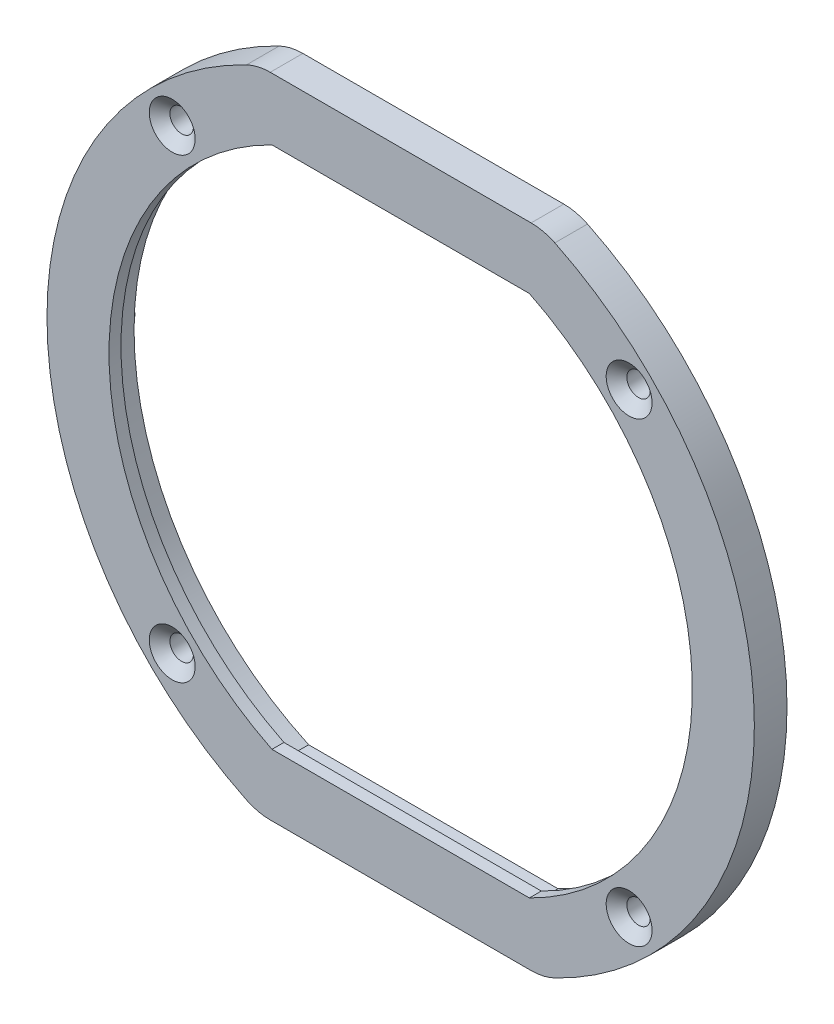
ISO-10303-21;
HEADER;
FILE_DESCRIPTION(('STEP AP214'),'2;1');
FILE_NAME('part.step','',(''),(''),'','','');
FILE_SCHEMA(('AUTOMOTIVE_DESIGN { 1 0 10303 214 1 1 1 1 }'));
ENDSEC;
DATA;
#1=APPLICATION_CONTEXT('core data for automotive mechanical design processes');
#2=APPLICATION_PROTOCOL_DEFINITION('international standard','automotive_design',2000,#1);
#3=PRODUCT_CONTEXT('',#1,'mechanical');
#4=PRODUCT('Part','Part','',(#3));
#5=PRODUCT_RELATED_PRODUCT_CATEGORY('part','',(#4));
#6=PRODUCT_DEFINITION_FORMATION('','',#4);
#7=PRODUCT_DEFINITION_CONTEXT('part definition',#1,'design');
#8=PRODUCT_DEFINITION('design','',#6,#7);
#9=PRODUCT_DEFINITION_SHAPE('','',#8);
#10=(LENGTH_UNIT() NAMED_UNIT(*) SI_UNIT(.MILLI.,.METRE.));
#11=(NAMED_UNIT(*) PLANE_ANGLE_UNIT() SI_UNIT($,.RADIAN.));
#12=(NAMED_UNIT(*) SI_UNIT($,.STERADIAN.) SOLID_ANGLE_UNIT());
#13=UNCERTAINTY_MEASURE_WITH_UNIT(LENGTH_MEASURE(1.E-05),#10,'distance_accuracy_value','');
#14=(GEOMETRIC_REPRESENTATION_CONTEXT(3) GLOBAL_UNCERTAINTY_ASSIGNED_CONTEXT((#13)) GLOBAL_UNIT_ASSIGNED_CONTEXT((#10,
#11,#12)) REPRESENTATION_CONTEXT('',''));
#15=CARTESIAN_POINT('',(0.,0.,0.));
#16=DIRECTION('',(0.,0.,1.));
#17=DIRECTION('',(1.,0.,0.));
#18=AXIS2_PLACEMENT_3D('',#15,#16,#17);
#19=CARTESIAN_POINT('',(0.,0.,6.));
#20=DIRECTION('',(0.,0.,-1.));
#21=DIRECTION('',(-1.,0.,0.));
#22=AXIS2_PLACEMENT_3D('',#19,#20,#21);
#23=CYLINDRICAL_SURFACE('',#22,53.6);
#24=DIRECTION('',(0.,0.,-1.));
#25=VECTOR('',#24,1.);
#26=CARTESIAN_POINT('',(23.6505813882027,48.1,6.));
#27=LINE('',#26,#25);
#28=CARTESIAN_POINT('',(23.6505813882027,48.1,6.));
#29=VERTEX_POINT('',#28);
#30=CARTESIAN_POINT('',(23.6505813882027,48.1,3.8));
#31=VERTEX_POINT('',#30);
#32=EDGE_CURVE('E294',#29,#31,#27,.T.);
#33=ORIENTED_EDGE('',*,*,#32,.T.);
#34=CARTESIAN_POINT('',(0.,0.,3.8));
#35=DIRECTION('',(0.,0.,-1.));
#36=DIRECTION('',(-1.,0.,0.));
#37=AXIS2_PLACEMENT_3D('',#34,#35,#36);
#38=CIRCLE('',#37,53.6);
#39=CARTESIAN_POINT('',(23.6505813882027,-48.1,3.8));
#40=VERTEX_POINT('',#39);
#41=EDGE_CURVE('E209',#31,#40,#38,.T.);
#42=ORIENTED_EDGE('',*,*,#41,.T.);
#43=DIRECTION('',(0.,0.,-1.));
#44=VECTOR('',#43,1.);
#45=CARTESIAN_POINT('',(23.6505813882027,-48.1,6.));
#46=LINE('',#45,#44);
#47=CARTESIAN_POINT('',(23.6505813882027,-48.1,6.));
#48=VERTEX_POINT('',#47);
#49=EDGE_CURVE('E282',#48,#40,#46,.T.);
#50=ORIENTED_EDGE('',*,*,#49,.F.);
#51=CARTESIAN_POINT('',(0.,0.,6.));
#52=DIRECTION('',(0.,0.,1.));
#53=DIRECTION('',(1.,0.,0.));
#54=AXIS2_PLACEMENT_3D('',#51,#52,#53);
#55=CIRCLE('',#54,53.6);
#56=EDGE_CURVE('E269',#48,#29,#55,.T.);
#57=ORIENTED_EDGE('',*,*,#56,.T.);
#58=EDGE_LOOP('',(#33,#42,#50,#57));
#59=FACE_BOUND('',#58,.T.);
#60=ADVANCED_FACE('F40',(#59),#23,.F.);
#61=CARTESIAN_POINT('',(-23.6505813882027,48.1,6.));
#62=DIRECTION('',(0.,-1.,0.));
#63=DIRECTION('',(0.,0.,-1.));
#64=AXIS2_PLACEMENT_3D('',#61,#62,#63);
#65=PLANE('',#64);
#66=DIRECTION('',(0.,0.,-1.));
#67=VECTOR('',#66,1.);
#68=CARTESIAN_POINT('',(-23.6505813882027,48.1,6.));
#69=LINE('',#68,#67);
#70=CARTESIAN_POINT('',(-23.6505813882027,48.1,6.));
#71=VERTEX_POINT('',#70);
#72=CARTESIAN_POINT('',(-23.6505813882027,48.1,3.8));
#73=VERTEX_POINT('',#72);
#74=EDGE_CURVE('E290',#71,#73,#69,.T.);
#75=ORIENTED_EDGE('',*,*,#74,.T.);
#76=DIRECTION('',(1.,0.,0.));
#77=VECTOR('',#76,1.);
#78=CARTESIAN_POINT('',(-23.6505813882027,48.1,3.8));
#79=LINE('',#78,#77);
#80=EDGE_CURVE('E205',#73,#31,#79,.T.);
#81=ORIENTED_EDGE('',*,*,#80,.T.);
#82=ORIENTED_EDGE('',*,*,#32,.F.);
#83=DIRECTION('',(-1.,0.,0.));
#84=VECTOR('',#83,1.);
#85=CARTESIAN_POINT('',(-23.6505813882027,48.1,6.));
#86=LINE('',#85,#84);
#87=EDGE_CURVE('E272',#29,#71,#86,.T.);
#88=ORIENTED_EDGE('',*,*,#87,.T.);
#89=EDGE_LOOP('',(#75,#81,#82,#88));
#90=FACE_BOUND('',#89,.T.);
#91=ADVANCED_FACE('F434',(#90),#65,.T.);
#92=CARTESIAN_POINT('',(0.,0.,6.));
#93=DIRECTION('',(0.,0.,-1.));
#94=DIRECTION('',(-1.,0.,0.));
#95=AXIS2_PLACEMENT_3D('',#92,#93,#94);
#96=CYLINDRICAL_SURFACE('',#95,53.6);
#97=DIRECTION('',(0.,0.,-1.));
#98=VECTOR('',#97,1.);
#99=CARTESIAN_POINT('',(-23.6505813882027,-48.1,6.));
#100=LINE('',#99,#98);
#101=CARTESIAN_POINT('',(-23.6505813882027,-48.1,6.));
#102=VERTEX_POINT('',#101);
#103=CARTESIAN_POINT('',(-23.6505813882027,-48.1,3.8));
#104=VERTEX_POINT('',#103);
#105=EDGE_CURVE('E286',#102,#104,#100,.T.);
#106=ORIENTED_EDGE('',*,*,#105,.T.);
#107=CARTESIAN_POINT('',(0.,0.,3.8));
#108=DIRECTION('',(0.,0.,-1.));
#109=DIRECTION('',(-1.,0.,0.));
#110=AXIS2_PLACEMENT_3D('',#107,#108,#109);
#111=CIRCLE('',#110,53.6);
#112=EDGE_CURVE('E64',#104,#73,#111,.T.);
#113=ORIENTED_EDGE('',*,*,#112,.T.);
#114=ORIENTED_EDGE('',*,*,#74,.F.);
#115=CARTESIAN_POINT('',(0.,0.,6.));
#116=DIRECTION('',(0.,0.,1.));
#117=DIRECTION('',(1.,0.,0.));
#118=AXIS2_PLACEMENT_3D('',#115,#116,#117);
#119=CIRCLE('',#118,53.6);
#120=EDGE_CURVE('E275',#71,#102,#119,.T.);
#121=ORIENTED_EDGE('',*,*,#120,.T.);
#122=EDGE_LOOP('',(#106,#113,#114,#121));
#123=FACE_BOUND('',#122,.T.);
#124=ADVANCED_FACE('F441',(#123),#96,.F.);
#125=CARTESIAN_POINT('',(-23.6505813882027,-48.1,6.));
#126=DIRECTION('',(0.,1.,0.));
#127=DIRECTION('',(0.,0.,1.));
#128=AXIS2_PLACEMENT_3D('',#125,#126,#127);
#129=PLANE('',#128);
#130=ORIENTED_EDGE('',*,*,#49,.T.);
#131=DIRECTION('',(-1.,0.,0.));
#132=VECTOR('',#131,1.);
#133=CARTESIAN_POINT('',(-23.6505813882027,-48.1,3.8));
#134=LINE('',#133,#132);
#135=EDGE_CURVE('E11',#40,#104,#134,.T.);
#136=ORIENTED_EDGE('',*,*,#135,.T.);
#137=ORIENTED_EDGE('',*,*,#105,.F.);
#138=DIRECTION('',(1.,0.,0.));
#139=VECTOR('',#138,1.);
#140=CARTESIAN_POINT('',(-23.6505813882027,-48.1,6.));
#141=LINE('',#140,#139);
#142=EDGE_CURVE('E279',#102,#48,#141,.T.);
#143=ORIENTED_EDGE('',*,*,#142,.T.);
#144=EDGE_LOOP('',(#130,#136,#137,#143));
#145=FACE_BOUND('',#144,.T.);
#146=ADVANCED_FACE('F448',(#145),#129,.T.);
#147=CARTESIAN_POINT('',(0.,0.,6.));
#148=DIRECTION('',(0.,0.,1.));
#149=DIRECTION('',(1.,0.,0.));
#150=AXIS2_PLACEMENT_3D('',#147,#148,#149);
#151=PLANE('',#150);
#152=CARTESIAN_POINT('',(41.985,41.985,6.));
#153=DIRECTION('',(0.,0.,1.));
#154=DIRECTION('',(1.,0.,0.));
#155=AXIS2_PLACEMENT_3D('',#152,#153,#154);
#156=CIRCLE('',#155,4.2164);
#157=CARTESIAN_POINT('',(46.2014,41.985,6.));
#158=VERTEX_POINT('',#157);
#159=EDGE_CURVE('E221',#158,#158,#156,.T.);
#160=ORIENTED_EDGE('',*,*,#159,.F.);
#161=EDGE_LOOP('',(#160));
#162=FACE_BOUND('',#161,.T.);
#163=CARTESIAN_POINT('',(-41.985,-41.985,6.));
#164=DIRECTION('',(0.,0.,1.));
#165=DIRECTION('',(1.,0.,0.));
#166=AXIS2_PLACEMENT_3D('',#163,#164,#165);
#167=CIRCLE('',#166,4.2164);
#168=CARTESIAN_POINT('',(-37.7686,-41.985,6.));
#169=VERTEX_POINT('',#168);
#170=EDGE_CURVE('E233',#169,#169,#167,.T.);
#171=ORIENTED_EDGE('',*,*,#170,.F.);
#172=EDGE_LOOP('',(#171));
#173=FACE_BOUND('',#172,.T.);
#174=CARTESIAN_POINT('',(-41.985,41.985,6.));
#175=DIRECTION('',(0.,0.,1.));
#176=DIRECTION('',(1.,0.,0.));
#177=AXIS2_PLACEMENT_3D('',#174,#175,#176);
#178=CIRCLE('',#177,4.2164);
#179=CARTESIAN_POINT('',(-37.7686,41.985,6.));
#180=VERTEX_POINT('',#179);
#181=EDGE_CURVE('E245',#180,#180,#178,.T.);
#182=ORIENTED_EDGE('',*,*,#181,.F.);
#183=EDGE_LOOP('',(#182));
#184=FACE_BOUND('',#183,.T.);
#185=CARTESIAN_POINT('',(41.985,-41.985,6.));
#186=DIRECTION('',(0.,0.,1.));
#187=DIRECTION('',(1.,0.,0.));
#188=AXIS2_PLACEMENT_3D('',#185,#186,#187);
#189=CIRCLE('',#188,4.2164);
#190=CARTESIAN_POINT('',(46.2014,-41.985,6.));
#191=VERTEX_POINT('',#190);
#192=EDGE_CURVE('E257',#191,#191,#189,.T.);
#193=ORIENTED_EDGE('',*,*,#192,.F.);
#194=EDGE_LOOP('',(#193));
#195=FACE_BOUND('',#194,.T.);
#196=DIRECTION('',(1.,0.,0.));
#197=VECTOR('',#196,1.);
#198=CARTESIAN_POINT('',(-26.167728216259,-59.5,6.));
#199=LINE('',#198,#197);
#200=CARTESIAN_POINT('',(-23.9739441894737,-59.5,6.));
#201=VERTEX_POINT('',#200);
#202=CARTESIAN_POINT('',(23.9739441894737,-59.5,6.));
#203=VERTEX_POINT('',#202);
#204=EDGE_CURVE('E312',#201,#203,#199,.T.);
#205=ORIENTED_EDGE('',*,*,#204,.T.);
#206=CARTESIAN_POINT('',(23.9739441894737,-49.5,6.));
#207=DIRECTION('',(0.,0.,1.));
#208=DIRECTION('',(1.,0.,0.));
#209=AXIS2_PLACEMENT_3D('',#206,#207,#208);
#210=CIRCLE('',#209,10.);
#211=CARTESIAN_POINT('',(28.3328431330144,-58.5,6.));
#212=VERTEX_POINT('',#211);
#213=EDGE_CURVE('E373',#203,#212,#210,.T.);
#214=ORIENTED_EDGE('',*,*,#213,.T.);
#215=CARTESIAN_POINT('',(0.,0.,6.));
#216=DIRECTION('',(0.,0.,1.));
#217=DIRECTION('',(1.,0.,0.));
#218=AXIS2_PLACEMENT_3D('',#215,#216,#217);
#219=CIRCLE('',#218,65.);
#220=CARTESIAN_POINT('',(28.3328431330144,58.5,6.));
#221=VERTEX_POINT('',#220);
#222=EDGE_CURVE('E299',#212,#221,#219,.T.);
#223=ORIENTED_EDGE('',*,*,#222,.T.);
#224=CARTESIAN_POINT('',(23.9739441894737,49.5,6.));
#225=DIRECTION('',(0.,0.,1.));
#226=DIRECTION('',(1.,0.,0.));
#227=AXIS2_PLACEMENT_3D('',#224,#225,#226);
#228=CIRCLE('',#227,10.);
#229=CARTESIAN_POINT('',(23.9739441894737,59.5,6.));
#230=VERTEX_POINT('',#229);
#231=EDGE_CURVE('E367',#221,#230,#228,.T.);
#232=ORIENTED_EDGE('',*,*,#231,.T.);
#233=DIRECTION('',(-1.,0.,0.));
#234=VECTOR('',#233,1.);
#235=CARTESIAN_POINT('',(-26.167728216259,59.5,6.));
#236=LINE('',#235,#234);
#237=CARTESIAN_POINT('',(-23.9739441894737,59.5,6.));
#238=VERTEX_POINT('',#237);
#239=EDGE_CURVE('E303',#230,#238,#236,.T.);
#240=ORIENTED_EDGE('',*,*,#239,.T.);
#241=CARTESIAN_POINT('',(-23.9739441894737,49.5,6.));
#242=DIRECTION('',(0.,0.,1.));
#243=DIRECTION('',(1.,0.,0.));
#244=AXIS2_PLACEMENT_3D('',#241,#242,#243);
#245=CIRCLE('',#244,10.);
#246=CARTESIAN_POINT('',(-28.3328431330144,58.5,6.));
#247=VERTEX_POINT('',#246);
#248=EDGE_CURVE('E364',#238,#247,#245,.T.);
#249=ORIENTED_EDGE('',*,*,#248,.T.);
#250=CARTESIAN_POINT('',(0.,0.,6.));
#251=DIRECTION('',(0.,0.,1.));
#252=DIRECTION('',(1.,0.,0.));
#253=AXIS2_PLACEMENT_3D('',#250,#251,#252);
#254=CIRCLE('',#253,65.);
#255=CARTESIAN_POINT('',(-28.3328431330144,-58.5,6.));
#256=VERTEX_POINT('',#255);
#257=EDGE_CURVE('E308',#247,#256,#254,.T.);
#258=ORIENTED_EDGE('',*,*,#257,.T.);
#259=CARTESIAN_POINT('',(-23.9739441894737,-49.5,6.));
#260=DIRECTION('',(0.,0.,1.));
#261=DIRECTION('',(1.,0.,0.));
#262=AXIS2_PLACEMENT_3D('',#259,#260,#261);
#263=CIRCLE('',#262,10.);
#264=EDGE_CURVE('E370',#256,#201,#263,.T.);
#265=ORIENTED_EDGE('',*,*,#264,.T.);
#266=EDGE_LOOP('',(#205,#214,#223,#232,#240,#249,#258,#265));
#267=FACE_BOUND('',#266,.T.);
#268=ORIENTED_EDGE('',*,*,#87,.F.);
#269=ORIENTED_EDGE('',*,*,#56,.F.);
#270=ORIENTED_EDGE('',*,*,#142,.F.);
#271=ORIENTED_EDGE('',*,*,#120,.F.);
#272=EDGE_LOOP('',(#268,#269,#270,#271));
#273=FACE_BOUND('',#272,.T.);
#274=ADVANCED_FACE('F408',(#162,#173,#184,#195,#267,#273),#151,.T.);
#275=CARTESIAN_POINT('',(0.,0.,0.));
#276=DIRECTION('',(0.,0.,1.));
#277=DIRECTION('',(1.,0.,0.));
#278=AXIS2_PLACEMENT_3D('',#275,#276,#277);
#279=PLANE('',#278);
#280=DIRECTION('',(1.,0.,0.));
#281=VECTOR('',#280,1.);
#282=CARTESIAN_POINT('',(-22.9128784747792,50.,0.));
#283=LINE('',#282,#281);
#284=CARTESIAN_POINT('',(-22.9128784747792,50.,0.));
#285=VERTEX_POINT('',#284);
#286=CARTESIAN_POINT('',(22.9128784747792,50.,0.));
#287=VERTEX_POINT('',#286);
#288=EDGE_CURVE('E189',#285,#287,#283,.T.);
#289=ORIENTED_EDGE('',*,*,#288,.F.);
#290=CARTESIAN_POINT('',(0.,0.,0.));
#291=DIRECTION('',(0.,0.,-1.));
#292=DIRECTION('',(-1.,0.,0.));
#293=AXIS2_PLACEMENT_3D('',#290,#291,#292);
#294=CIRCLE('',#293,55.);
#295=CARTESIAN_POINT('',(-22.9128784747792,-50.,0.));
#296=VERTEX_POINT('',#295);
#297=EDGE_CURVE('E56',#296,#285,#294,.T.);
#298=ORIENTED_EDGE('',*,*,#297,.F.);
#299=DIRECTION('',(-1.,0.,0.));
#300=VECTOR('',#299,1.);
#301=CARTESIAN_POINT('',(22.9128784747792,-50.,0.));
#302=LINE('',#301,#300);
#303=CARTESIAN_POINT('',(22.9128784747792,-50.,0.));
#304=VERTEX_POINT('',#303);
#305=EDGE_CURVE('E176',#304,#296,#302,.T.);
#306=ORIENTED_EDGE('',*,*,#305,.F.);
#307=CARTESIAN_POINT('',(0.,0.,0.));
#308=DIRECTION('',(0.,0.,-1.));
#309=DIRECTION('',(-1.,0.,0.));
#310=AXIS2_PLACEMENT_3D('',#307,#308,#309);
#311=CIRCLE('',#310,55.);
#312=EDGE_CURVE('E180',#287,#304,#311,.T.);
#313=ORIENTED_EDGE('',*,*,#312,.F.);
#314=EDGE_LOOP('',(#289,#298,#306,#313));
#315=FACE_BOUND('',#314,.T.);
#316=CARTESIAN_POINT('',(-59.2455,0.,0.));
#317=DIRECTION('',(0.,0.,1.));
#318=DIRECTION('',(1.,0.,0.));
#319=AXIS2_PLACEMENT_3D('',#316,#317,#318);
#320=CIRCLE('',#319,1.905);
#321=CARTESIAN_POINT('',(-57.3405,0.,0.));
#322=VERTEX_POINT('',#321);
#323=EDGE_CURVE('E334',#322,#322,#320,.F.);
#324=ORIENTED_EDGE('',*,*,#323,.F.);
#325=EDGE_LOOP('',(#324));
#326=FACE_BOUND('',#325,.T.);
#327=CARTESIAN_POINT('',(59.2455,0.,0.));
#328=DIRECTION('',(0.,0.,1.));
#329=DIRECTION('',(1.,0.,0.));
#330=AXIS2_PLACEMENT_3D('',#327,#328,#329);
#331=CIRCLE('',#330,1.905);
#332=CARTESIAN_POINT('',(61.1505,0.,0.));
#333=VERTEX_POINT('',#332);
#334=EDGE_CURVE('E316',#333,#333,#331,.F.);
#335=ORIENTED_EDGE('',*,*,#334,.F.);
#336=EDGE_LOOP('',(#335));
#337=FACE_BOUND('',#336,.T.);
#338=CARTESIAN_POINT('',(41.985,41.985,0.));
#339=DIRECTION('',(0.,0.,1.));
#340=DIRECTION('',(1.,0.,0.));
#341=AXIS2_PLACEMENT_3D('',#338,#339,#340);
#342=CIRCLE('',#341,2.15265);
#343=CARTESIAN_POINT('',(44.13765,41.985,0.));
#344=VERTEX_POINT('',#343);
#345=EDGE_CURVE('E229',#344,#344,#342,.T.);
#346=ORIENTED_EDGE('',*,*,#345,.T.);
#347=EDGE_LOOP('',(#346));
#348=FACE_BOUND('',#347,.T.);
#349=CARTESIAN_POINT('',(-41.985,-41.985,0.));
#350=DIRECTION('',(0.,0.,1.));
#351=DIRECTION('',(1.,0.,0.));
#352=AXIS2_PLACEMENT_3D('',#349,#350,#351);
#353=CIRCLE('',#352,2.15265);
#354=CARTESIAN_POINT('',(-39.83235,-41.985,0.));
#355=VERTEX_POINT('',#354);
#356=EDGE_CURVE('E241',#355,#355,#353,.T.);
#357=ORIENTED_EDGE('',*,*,#356,.T.);
#358=EDGE_LOOP('',(#357));
#359=FACE_BOUND('',#358,.T.);
#360=CARTESIAN_POINT('',(-41.985,41.985,0.));
#361=DIRECTION('',(0.,0.,1.));
#362=DIRECTION('',(1.,0.,0.));
#363=AXIS2_PLACEMENT_3D('',#360,#361,#362);
#364=CIRCLE('',#363,2.15265);
#365=CARTESIAN_POINT('',(-39.83235,41.985,0.));
#366=VERTEX_POINT('',#365);
#367=EDGE_CURVE('E253',#366,#366,#364,.T.);
#368=ORIENTED_EDGE('',*,*,#367,.T.);
#369=EDGE_LOOP('',(#368));
#370=FACE_BOUND('',#369,.T.);
#371=CARTESIAN_POINT('',(41.985,-41.985,0.));
#372=DIRECTION('',(0.,0.,1.));
#373=DIRECTION('',(1.,0.,0.));
#374=AXIS2_PLACEMENT_3D('',#371,#372,#373);
#375=CIRCLE('',#374,2.15265);
#376=CARTESIAN_POINT('',(44.13765,-41.985,0.));
#377=VERTEX_POINT('',#376);
#378=EDGE_CURVE('E265',#377,#377,#375,.T.);
#379=ORIENTED_EDGE('',*,*,#378,.T.);
#380=EDGE_LOOP('',(#379));
#381=FACE_BOUND('',#380,.T.);
#382=CARTESIAN_POINT('',(0.,0.,0.));
#383=DIRECTION('',(0.,0.,1.));
#384=DIRECTION('',(1.,0.,0.));
#385=AXIS2_PLACEMENT_3D('',#382,#383,#384);
#386=CIRCLE('',#385,65.);
#387=CARTESIAN_POINT('',(28.3328431330144,-58.5,0.));
#388=VERTEX_POINT('',#387);
#389=CARTESIAN_POINT('',(28.3328431330144,58.5,0.));
#390=VERTEX_POINT('',#389);
#391=EDGE_CURVE('E298',#388,#390,#386,.T.);
#392=ORIENTED_EDGE('',*,*,#391,.F.);
#393=CARTESIAN_POINT('',(23.9739441894737,-49.5,0.));
#394=DIRECTION('',(0.,0.,1.));
#395=DIRECTION('',(1.,0.,0.));
#396=AXIS2_PLACEMENT_3D('',#393,#394,#395);
#397=CIRCLE('',#396,10.);
#398=CARTESIAN_POINT('',(23.9739441894737,-59.5,0.));
#399=VERTEX_POINT('',#398);
#400=EDGE_CURVE('E354',#388,#399,#397,.F.);
#401=ORIENTED_EDGE('',*,*,#400,.T.);
#402=DIRECTION('',(1.,0.,0.));
#403=VECTOR('',#402,1.);
#404=CARTESIAN_POINT('',(-26.167728216259,-59.5,0.));
#405=LINE('',#404,#403);
#406=CARTESIAN_POINT('',(-23.9739441894737,-59.5,0.));
#407=VERTEX_POINT('',#406);
#408=EDGE_CURVE('E304',#407,#399,#405,.T.);
#409=ORIENTED_EDGE('',*,*,#408,.F.);
#410=CARTESIAN_POINT('',(-23.9739441894737,-49.5,0.));
#411=DIRECTION('',(0.,0.,1.));
#412=DIRECTION('',(1.,0.,0.));
#413=AXIS2_PLACEMENT_3D('',#410,#411,#412);
#414=CIRCLE('',#413,10.);
#415=CARTESIAN_POINT('',(-28.3328431330144,-58.5,0.));
#416=VERTEX_POINT('',#415);
#417=EDGE_CURVE('E351',#407,#416,#414,.F.);
#418=ORIENTED_EDGE('',*,*,#417,.T.);
#419=CARTESIAN_POINT('',(0.,0.,0.));
#420=DIRECTION('',(0.,0.,1.));
#421=DIRECTION('',(1.,0.,0.));
#422=AXIS2_PLACEMENT_3D('',#419,#420,#421);
#423=CIRCLE('',#422,65.);
#424=CARTESIAN_POINT('',(-28.3328431330144,58.5,0.));
#425=VERTEX_POINT('',#424);
#426=EDGE_CURVE('E324',#425,#416,#423,.T.);
#427=ORIENTED_EDGE('',*,*,#426,.F.);
#428=CARTESIAN_POINT('',(-23.9739441894737,49.5,0.));
#429=DIRECTION('',(0.,0.,1.));
#430=DIRECTION('',(1.,0.,0.));
#431=AXIS2_PLACEMENT_3D('',#428,#429,#430);
#432=CIRCLE('',#431,10.);
#433=CARTESIAN_POINT('',(-23.9739441894737,59.5,0.));
#434=VERTEX_POINT('',#433);
#435=EDGE_CURVE('E345',#425,#434,#432,.F.);
#436=ORIENTED_EDGE('',*,*,#435,.T.);
#437=DIRECTION('',(-1.,0.,0.));
#438=VECTOR('',#437,1.);
#439=CARTESIAN_POINT('',(-26.167728216259,59.5,0.));
#440=LINE('',#439,#438);
#441=CARTESIAN_POINT('',(23.9739441894737,59.5,0.));
#442=VERTEX_POINT('',#441);
#443=EDGE_CURVE('E320',#442,#434,#440,.T.);
#444=ORIENTED_EDGE('',*,*,#443,.F.);
#445=CARTESIAN_POINT('',(23.9739441894737,49.5,0.));
#446=DIRECTION('',(0.,0.,1.));
#447=DIRECTION('',(1.,0.,0.));
#448=AXIS2_PLACEMENT_3D('',#445,#446,#447);
#449=CIRCLE('',#448,10.);
#450=EDGE_CURVE('E348',#442,#390,#449,.F.);
#451=ORIENTED_EDGE('',*,*,#450,.T.);
#452=EDGE_LOOP('',(#392,#401,#409,#418,#427,#436,#444,#451));
#453=FACE_BOUND('',#452,.T.);
#454=ADVANCED_FACE('F397',(#315,#326,#337,#348,#359,#370,#381,#453),#279,.F.);
#455=CARTESIAN_POINT('',(0.,0.,6.));
#456=DIRECTION('',(0.,0.,-1.));
#457=DIRECTION('',(-1.,0.,0.));
#458=AXIS2_PLACEMENT_3D('',#455,#456,#457);
#459=CYLINDRICAL_SURFACE('',#458,65.);
#460=ORIENTED_EDGE('',*,*,#222,.F.);
#461=DIRECTION('',(0.,0.,-1.));
#462=VECTOR('',#461,1.);
#463=CARTESIAN_POINT('',(28.3328431330144,-58.5,6.));
#464=LINE('',#463,#462);
#465=EDGE_CURVE('E341',#212,#388,#464,.T.);
#466=ORIENTED_EDGE('',*,*,#465,.T.);
#467=ORIENTED_EDGE('',*,*,#391,.T.);
#468=DIRECTION('',(0.,0.,-1.));
#469=VECTOR('',#468,1.);
#470=CARTESIAN_POINT('',(28.3328431330144,58.5,6.));
#471=LINE('',#470,#469);
#472=EDGE_CURVE('E338',#390,#221,#471,.F.);
#473=ORIENTED_EDGE('',*,*,#472,.T.);
#474=EDGE_LOOP('',(#460,#466,#467,#473));
#475=FACE_BOUND('',#474,.T.);
#476=ADVANCED_FACE('F424',(#475),#459,.T.);
#477=CARTESIAN_POINT('',(-26.167728216259,59.5,6.));
#478=DIRECTION('',(0.,-1.,0.));
#479=DIRECTION('',(1.,0.,0.));
#480=AXIS2_PLACEMENT_3D('',#477,#478,#479);
#481=PLANE('',#480);
#482=ORIENTED_EDGE('',*,*,#239,.F.);
#483=DIRECTION('',(0.,0.,-1.));
#484=VECTOR('',#483,1.);
#485=CARTESIAN_POINT('',(23.9739441894737,59.5,6.));
#486=LINE('',#485,#484);
#487=EDGE_CURVE('E49',#230,#442,#486,.T.);
#488=ORIENTED_EDGE('',*,*,#487,.T.);
#489=ORIENTED_EDGE('',*,*,#443,.T.);
#490=DIRECTION('',(0.,0.,-1.));
#491=VECTOR('',#490,1.);
#492=CARTESIAN_POINT('',(-23.9739441894737,59.5,6.));
#493=LINE('',#492,#491);
#494=EDGE_CURVE('E383',#434,#238,#493,.F.);
#495=ORIENTED_EDGE('',*,*,#494,.T.);
#496=EDGE_LOOP('',(#482,#488,#489,#495));
#497=FACE_BOUND('',#496,.T.);
#498=ADVANCED_FACE('F391',(#497),#481,.F.);
#499=CARTESIAN_POINT('',(0.,0.,6.));
#500=DIRECTION('',(0.,0.,-1.));
#501=DIRECTION('',(-1.,0.,0.));
#502=AXIS2_PLACEMENT_3D('',#499,#500,#501);
#503=CYLINDRICAL_SURFACE('',#502,65.);
#504=ORIENTED_EDGE('',*,*,#426,.T.);
#505=DIRECTION('',(0.,0.,-1.));
#506=VECTOR('',#505,1.);
#507=CARTESIAN_POINT('',(-28.3328431330144,-58.5,6.));
#508=LINE('',#507,#506);
#509=EDGE_CURVE('E380',#416,#256,#508,.F.);
#510=ORIENTED_EDGE('',*,*,#509,.T.);
#511=ORIENTED_EDGE('',*,*,#257,.F.);
#512=DIRECTION('',(0.,0.,-1.));
#513=VECTOR('',#512,1.);
#514=CARTESIAN_POINT('',(-28.3328431330144,58.5,6.));
#515=LINE('',#514,#513);
#516=EDGE_CURVE('E376',#247,#425,#515,.T.);
#517=ORIENTED_EDGE('',*,*,#516,.T.);
#518=EDGE_LOOP('',(#504,#510,#511,#517));
#519=FACE_BOUND('',#518,.T.);
#520=ADVANCED_FACE('F404',(#519),#503,.T.);
#521=CARTESIAN_POINT('',(-26.167728216259,-59.5,6.));
#522=DIRECTION('',(0.,1.,0.));
#523=DIRECTION('',(-1.,0.,0.));
#524=AXIS2_PLACEMENT_3D('',#521,#522,#523);
#525=PLANE('',#524);
#526=ORIENTED_EDGE('',*,*,#408,.T.);
#527=DIRECTION('',(0.,0.,-1.));
#528=VECTOR('',#527,1.);
#529=CARTESIAN_POINT('',(23.9739441894737,-59.5,6.));
#530=LINE('',#529,#528);
#531=EDGE_CURVE('E361',#399,#203,#530,.F.);
#532=ORIENTED_EDGE('',*,*,#531,.T.);
#533=ORIENTED_EDGE('',*,*,#204,.F.);
#534=DIRECTION('',(0.,0.,-1.));
#535=VECTOR('',#534,1.);
#536=CARTESIAN_POINT('',(-23.9739441894737,-59.5,6.));
#537=LINE('',#536,#535);
#538=EDGE_CURVE('E357',#201,#407,#537,.T.);
#539=ORIENTED_EDGE('',*,*,#538,.T.);
#540=EDGE_LOOP('',(#526,#532,#533,#539));
#541=FACE_BOUND('',#540,.T.);
#542=ADVANCED_FACE('F416',(#541),#525,.F.);
#543=CARTESIAN_POINT('',(41.985,-41.985,6.));
#544=DIRECTION('',(0.,0.,1.));
#545=DIRECTION('',(1.,0.,0.));
#546=AXIS2_PLACEMENT_3D('',#543,#544,#545);
#547=CYLINDRICAL_SURFACE('',#546,2.15265);
#548=ORIENTED_EDGE('',*,*,#378,.F.);
#549=EDGE_LOOP('',(#548));
#550=FACE_BOUND('',#549,.T.);
#551=CARTESIAN_POINT('',(41.985,-41.985,4.26830813615789));
#552=DIRECTION('',(0.,0.,1.));
#553=DIRECTION('',(1.,0.,0.));
#554=AXIS2_PLACEMENT_3D('',#551,#552,#553);
#555=CIRCLE('',#554,2.15265);
#556=CARTESIAN_POINT('',(44.13765,-41.985,4.26830813615789));
#557=VERTEX_POINT('',#556);
#558=EDGE_CURVE('E261',#557,#557,#555,.T.);
#559=ORIENTED_EDGE('',*,*,#558,.T.);
#560=EDGE_LOOP('',(#559));
#561=FACE_BOUND('',#560,.T.);
#562=ADVANCED_FACE('F455',(#550,#561),#547,.F.);
#563=CARTESIAN_POINT('',(41.985,-41.985,6.));
#564=DIRECTION('',(0.,0.,1.));
#565=DIRECTION('',(1.,0.,0.));
#566=AXIS2_PLACEMENT_3D('',#563,#564,#565);
#567=CONICAL_SURFACE('',#566,4.2164,0.872664625997165);
#568=ORIENTED_EDGE('',*,*,#558,.F.);
#569=EDGE_LOOP('',(#568));
#570=FACE_BOUND('',#569,.T.);
#571=ORIENTED_EDGE('',*,*,#192,.T.);
#572=EDGE_LOOP('',(#571));
#573=FACE_BOUND('',#572,.T.);
#574=ADVANCED_FACE('F509',(#570,#573),#567,.F.);
#575=CARTESIAN_POINT('',(-41.985,41.985,6.));
#576=DIRECTION('',(0.,0.,1.));
#577=DIRECTION('',(1.,0.,0.));
#578=AXIS2_PLACEMENT_3D('',#575,#576,#577);
#579=CYLINDRICAL_SURFACE('',#578,2.15265);
#580=ORIENTED_EDGE('',*,*,#367,.F.);
#581=EDGE_LOOP('',(#580));
#582=FACE_BOUND('',#581,.T.);
#583=CARTESIAN_POINT('',(-41.985,41.985,4.26830813615789));
#584=DIRECTION('',(0.,0.,1.));
#585=DIRECTION('',(1.,0.,0.));
#586=AXIS2_PLACEMENT_3D('',#583,#584,#585);
#587=CIRCLE('',#586,2.15265);
#588=CARTESIAN_POINT('',(-39.83235,41.985,4.26830813615789));
#589=VERTEX_POINT('',#588);
#590=EDGE_CURVE('E249',#589,#589,#587,.T.);
#591=ORIENTED_EDGE('',*,*,#590,.T.);
#592=EDGE_LOOP('',(#591));
#593=FACE_BOUND('',#592,.T.);
#594=ADVANCED_FACE('F505',(#582,#593),#579,.F.);
#595=CARTESIAN_POINT('',(-41.985,41.985,6.));
#596=DIRECTION('',(0.,0.,1.));
#597=DIRECTION('',(1.,0.,0.));
#598=AXIS2_PLACEMENT_3D('',#595,#596,#597);
#599=CONICAL_SURFACE('',#598,4.2164,0.872664625997165);
#600=ORIENTED_EDGE('',*,*,#590,.F.);
#601=EDGE_LOOP('',(#600));
#602=FACE_BOUND('',#601,.T.);
#603=ORIENTED_EDGE('',*,*,#181,.T.);
#604=EDGE_LOOP('',(#603));
#605=FACE_BOUND('',#604,.T.);
#606=ADVANCED_FACE('F501',(#602,#605),#599,.F.);
#607=CARTESIAN_POINT('',(-41.985,-41.985,6.));
#608=DIRECTION('',(0.,0.,1.));
#609=DIRECTION('',(1.,0.,0.));
#610=AXIS2_PLACEMENT_3D('',#607,#608,#609);
#611=CYLINDRICAL_SURFACE('',#610,2.15265);
#612=ORIENTED_EDGE('',*,*,#356,.F.);
#613=EDGE_LOOP('',(#612));
#614=FACE_BOUND('',#613,.T.);
#615=CARTESIAN_POINT('',(-41.985,-41.985,4.26830813615789));
#616=DIRECTION('',(0.,0.,1.));
#617=DIRECTION('',(1.,0.,0.));
#618=AXIS2_PLACEMENT_3D('',#615,#616,#617);
#619=CIRCLE('',#618,2.15265);
#620=CARTESIAN_POINT('',(-39.83235,-41.985,4.26830813615789));
#621=VERTEX_POINT('',#620);
#622=EDGE_CURVE('E237',#621,#621,#619,.T.);
#623=ORIENTED_EDGE('',*,*,#622,.T.);
#624=EDGE_LOOP('',(#623));
#625=FACE_BOUND('',#624,.T.);
#626=ADVANCED_FACE('F497',(#614,#625),#611,.F.);
#627=CARTESIAN_POINT('',(-41.985,-41.985,6.));
#628=DIRECTION('',(0.,0.,1.));
#629=DIRECTION('',(1.,0.,0.));
#630=AXIS2_PLACEMENT_3D('',#627,#628,#629);
#631=CONICAL_SURFACE('',#630,4.2164,0.872664625997165);
#632=ORIENTED_EDGE('',*,*,#622,.F.);
#633=EDGE_LOOP('',(#632));
#634=FACE_BOUND('',#633,.T.);
#635=ORIENTED_EDGE('',*,*,#170,.T.);
#636=EDGE_LOOP('',(#635));
#637=FACE_BOUND('',#636,.T.);
#638=ADVANCED_FACE('F493',(#634,#637),#631,.F.);
#639=CARTESIAN_POINT('',(41.985,41.985,6.));
#640=DIRECTION('',(0.,0.,1.));
#641=DIRECTION('',(1.,0.,0.));
#642=AXIS2_PLACEMENT_3D('',#639,#640,#641);
#643=CYLINDRICAL_SURFACE('',#642,2.15265);
#644=ORIENTED_EDGE('',*,*,#345,.F.);
#645=EDGE_LOOP('',(#644));
#646=FACE_BOUND('',#645,.T.);
#647=CARTESIAN_POINT('',(41.985,41.985,4.26830813615789));
#648=DIRECTION('',(0.,0.,1.));
#649=DIRECTION('',(1.,0.,0.));
#650=AXIS2_PLACEMENT_3D('',#647,#648,#649);
#651=CIRCLE('',#650,2.15265);
#652=CARTESIAN_POINT('',(44.13765,41.985,4.26830813615789));
#653=VERTEX_POINT('',#652);
#654=EDGE_CURVE('E225',#653,#653,#651,.T.);
#655=ORIENTED_EDGE('',*,*,#654,.T.);
#656=EDGE_LOOP('',(#655));
#657=FACE_BOUND('',#656,.T.);
#658=ADVANCED_FACE('F489',(#646,#657),#643,.F.);
#659=CARTESIAN_POINT('',(41.985,41.985,6.));
#660=DIRECTION('',(0.,0.,1.));
#661=DIRECTION('',(1.,0.,0.));
#662=AXIS2_PLACEMENT_3D('',#659,#660,#661);
#663=CONICAL_SURFACE('',#662,4.2164,0.872664625997165);
#664=ORIENTED_EDGE('',*,*,#654,.F.);
#665=EDGE_LOOP('',(#664));
#666=FACE_BOUND('',#665,.T.);
#667=ORIENTED_EDGE('',*,*,#159,.T.);
#668=EDGE_LOOP('',(#667));
#669=FACE_BOUND('',#668,.T.);
#670=ADVANCED_FACE('F485',(#666,#669),#663,.F.);
#671=CARTESIAN_POINT('',(59.2455,0.,-2.5));
#672=DIRECTION('',(0.,0.,1.));
#673=DIRECTION('',(1.,0.,0.));
#674=AXIS2_PLACEMENT_3D('',#671,#672,#673);
#675=CYLINDRICAL_SURFACE('',#674,1.905);
#676=CARTESIAN_POINT('',(59.2455,0.,-2.5));
#677=DIRECTION('',(0.,0.,-1.));
#678=DIRECTION('',(-1.,0.,0.));
#679=AXIS2_PLACEMENT_3D('',#676,#677,#678);
#680=CIRCLE('',#679,1.905);
#681=CARTESIAN_POINT('',(57.3405,0.,-2.5));
#682=VERTEX_POINT('',#681);
#683=EDGE_CURVE('E217',#682,#682,#680,.T.);
#684=ORIENTED_EDGE('',*,*,#683,.F.);
#685=EDGE_LOOP('',(#684));
#686=FACE_BOUND('',#685,.T.);
#687=ORIENTED_EDGE('',*,*,#334,.T.);
#688=EDGE_LOOP('',(#687));
#689=FACE_BOUND('',#688,.T.);
#690=ADVANCED_FACE('F481',(#686,#689),#675,.T.);
#691=CARTESIAN_POINT('',(59.2455,0.,-2.5));
#692=DIRECTION('',(0.,0.,-1.));
#693=DIRECTION('',(-1.,0.,0.));
#694=AXIS2_PLACEMENT_3D('',#691,#692,#693);
#695=PLANE('',#694);
#696=ORIENTED_EDGE('',*,*,#683,.T.);
#697=EDGE_LOOP('',(#696));
#698=FACE_BOUND('',#697,.T.);
#699=ADVANCED_FACE('F473',(#698),#695,.T.);
#700=CARTESIAN_POINT('',(-59.2455,0.,-2.5));
#701=DIRECTION('',(0.,0.,1.));
#702=DIRECTION('',(1.,0.,0.));
#703=AXIS2_PLACEMENT_3D('',#700,#701,#702);
#704=CYLINDRICAL_SURFACE('',#703,1.905);
#705=CARTESIAN_POINT('',(-59.2455,0.,-2.5));
#706=DIRECTION('',(0.,0.,-1.));
#707=DIRECTION('',(-1.,0.,0.));
#708=AXIS2_PLACEMENT_3D('',#705,#706,#707);
#709=CIRCLE('',#708,1.905);
#710=CARTESIAN_POINT('',(-61.1505,0.,-2.5));
#711=VERTEX_POINT('',#710);
#712=EDGE_CURVE('E213',#711,#711,#709,.T.);
#713=ORIENTED_EDGE('',*,*,#712,.F.);
#714=EDGE_LOOP('',(#713));
#715=FACE_BOUND('',#714,.T.);
#716=ORIENTED_EDGE('',*,*,#323,.T.);
#717=EDGE_LOOP('',(#716));
#718=FACE_BOUND('',#717,.T.);
#719=ADVANCED_FACE('F467',(#715,#718),#704,.T.);
#720=CARTESIAN_POINT('',(-59.2455,0.,-2.5));
#721=DIRECTION('',(0.,0.,-1.));
#722=DIRECTION('',(-1.,0.,0.));
#723=AXIS2_PLACEMENT_3D('',#720,#721,#722);
#724=PLANE('',#723);
#725=ORIENTED_EDGE('',*,*,#712,.T.);
#726=EDGE_LOOP('',(#725));
#727=FACE_BOUND('',#726,.T.);
#728=ADVANCED_FACE('F463',(#727),#724,.T.);
#729=CARTESIAN_POINT('',(23.9739441894737,-49.5,6.));
#730=DIRECTION('',(0.,0.,-1.));
#731=DIRECTION('',(-1.,0.,0.));
#732=AXIS2_PLACEMENT_3D('',#729,#730,#731);
#733=CYLINDRICAL_SURFACE('',#732,10.);
#734=ORIENTED_EDGE('',*,*,#213,.F.);
#735=ORIENTED_EDGE('',*,*,#531,.F.);
#736=ORIENTED_EDGE('',*,*,#400,.F.);
#737=ORIENTED_EDGE('',*,*,#465,.F.);
#738=EDGE_LOOP('',(#734,#735,#736,#737));
#739=FACE_BOUND('',#738,.T.);
#740=ADVANCED_FACE('F421',(#739),#733,.T.);
#741=CARTESIAN_POINT('',(-23.9739441894737,-49.5,6.));
#742=DIRECTION('',(0.,0.,-1.));
#743=DIRECTION('',(-1.,0.,0.));
#744=AXIS2_PLACEMENT_3D('',#741,#742,#743);
#745=CYLINDRICAL_SURFACE('',#744,10.);
#746=ORIENTED_EDGE('',*,*,#264,.F.);
#747=ORIENTED_EDGE('',*,*,#509,.F.);
#748=ORIENTED_EDGE('',*,*,#417,.F.);
#749=ORIENTED_EDGE('',*,*,#538,.F.);
#750=EDGE_LOOP('',(#746,#747,#748,#749));
#751=FACE_BOUND('',#750,.T.);
#752=ADVANCED_FACE('F413',(#751),#745,.T.);
#753=CARTESIAN_POINT('',(23.9739441894737,49.5,6.));
#754=DIRECTION('',(0.,0.,-1.));
#755=DIRECTION('',(-1.,0.,0.));
#756=AXIS2_PLACEMENT_3D('',#753,#754,#755);
#757=CYLINDRICAL_SURFACE('',#756,10.);
#758=ORIENTED_EDGE('',*,*,#231,.F.);
#759=ORIENTED_EDGE('',*,*,#472,.F.);
#760=ORIENTED_EDGE('',*,*,#450,.F.);
#761=ORIENTED_EDGE('',*,*,#487,.F.);
#762=EDGE_LOOP('',(#758,#759,#760,#761));
#763=FACE_BOUND('',#762,.T.);
#764=ADVANCED_FACE('F426',(#763),#757,.T.);
#765=CARTESIAN_POINT('',(-23.9739441894737,49.5,6.));
#766=DIRECTION('',(0.,0.,-1.));
#767=DIRECTION('',(-1.,0.,0.));
#768=AXIS2_PLACEMENT_3D('',#765,#766,#767);
#769=CYLINDRICAL_SURFACE('',#768,10.);
#770=ORIENTED_EDGE('',*,*,#248,.F.);
#771=ORIENTED_EDGE('',*,*,#494,.F.);
#772=ORIENTED_EDGE('',*,*,#435,.F.);
#773=ORIENTED_EDGE('',*,*,#516,.F.);
#774=EDGE_LOOP('',(#770,#771,#772,#773));
#775=FACE_BOUND('',#774,.T.);
#776=ADVANCED_FACE('F42',(#775),#769,.T.);
#777=CARTESIAN_POINT('',(0.,0.,3.8));
#778=DIRECTION('',(0.,0.,-1.));
#779=DIRECTION('',(-1.,0.,0.));
#780=AXIS2_PLACEMENT_3D('',#777,#778,#779);
#781=CYLINDRICAL_SURFACE('',#780,55.);
#782=ORIENTED_EDGE('',*,*,#297,.T.);
#783=DIRECTION('',(0.,0.,-1.));
#784=VECTOR('',#783,1.);
#785=CARTESIAN_POINT('',(-22.9128784747792,50.,3.8));
#786=LINE('',#785,#784);
#787=CARTESIAN_POINT('',(-22.9128784747792,50.,3.8));
#788=VERTEX_POINT('',#787);
#789=EDGE_CURVE('E151',#788,#285,#786,.T.);
#790=ORIENTED_EDGE('',*,*,#789,.F.);
#791=CARTESIAN_POINT('',(0.,0.,3.8));
#792=DIRECTION('',(0.,0.,-1.));
#793=DIRECTION('',(-1.,0.,0.));
#794=AXIS2_PLACEMENT_3D('',#791,#792,#793);
#795=CIRCLE('',#794,55.);
#796=CARTESIAN_POINT('',(-22.9128784747792,-50.,3.8));
#797=VERTEX_POINT('',#796);
#798=EDGE_CURVE('E155',#797,#788,#795,.T.);
#799=ORIENTED_EDGE('',*,*,#798,.F.);
#800=DIRECTION('',(0.,0.,-1.));
#801=VECTOR('',#800,1.);
#802=CARTESIAN_POINT('',(-22.9128784747792,-50.,3.8));
#803=LINE('',#802,#801);
#804=EDGE_CURVE('E195',#797,#296,#803,.T.);
#805=ORIENTED_EDGE('',*,*,#804,.T.);
#806=EDGE_LOOP('',(#782,#790,#799,#805));
#807=FACE_BOUND('',#806,.T.);
#808=ADVANCED_FACE('F153',(#807),#781,.F.);
#809=CARTESIAN_POINT('',(22.9128784747792,-50.,3.8));
#810=DIRECTION('',(0.,-1.,0.));
#811=DIRECTION('',(0.,0.,-1.));
#812=AXIS2_PLACEMENT_3D('',#809,#810,#811);
#813=PLANE('',#812);
#814=ORIENTED_EDGE('',*,*,#305,.T.);
#815=ORIENTED_EDGE('',*,*,#804,.F.);
#816=DIRECTION('',(-1.,0.,0.));
#817=VECTOR('',#816,1.);
#818=CARTESIAN_POINT('',(22.9128784747792,-50.,3.8));
#819=LINE('',#818,#817);
#820=CARTESIAN_POINT('',(22.9128784747792,-50.,3.8));
#821=VERTEX_POINT('',#820);
#822=EDGE_CURVE('E162',#821,#797,#819,.T.);
#823=ORIENTED_EDGE('',*,*,#822,.F.);
#824=DIRECTION('',(0.,0.,-1.));
#825=VECTOR('',#824,1.);
#826=CARTESIAN_POINT('',(22.9128784747792,-50.,3.8));
#827=LINE('',#826,#825);
#828=EDGE_CURVE('E198',#821,#304,#827,.T.);
#829=ORIENTED_EDGE('',*,*,#828,.T.);
#830=EDGE_LOOP('',(#814,#815,#823,#829));
#831=FACE_BOUND('',#830,.T.);
#832=ADVANCED_FACE('F537',(#831),#813,.F.);
#833=CARTESIAN_POINT('',(0.,0.,3.8));
#834=DIRECTION('',(0.,0.,-1.));
#835=DIRECTION('',(-1.,0.,0.));
#836=AXIS2_PLACEMENT_3D('',#833,#834,#835);
#837=CYLINDRICAL_SURFACE('',#836,55.);
#838=ORIENTED_EDGE('',*,*,#312,.T.);
#839=ORIENTED_EDGE('',*,*,#828,.F.);
#840=CARTESIAN_POINT('',(0.,0.,3.8));
#841=DIRECTION('',(0.,0.,-1.));
#842=DIRECTION('',(-1.,0.,0.));
#843=AXIS2_PLACEMENT_3D('',#840,#841,#842);
#844=CIRCLE('',#843,55.);
#845=CARTESIAN_POINT('',(22.9128784747792,50.,3.8));
#846=VERTEX_POINT('',#845);
#847=EDGE_CURVE('E171',#846,#821,#844,.T.);
#848=ORIENTED_EDGE('',*,*,#847,.F.);
#849=DIRECTION('',(0.,0.,-1.));
#850=VECTOR('',#849,1.);
#851=CARTESIAN_POINT('',(22.9128784747792,50.,3.8));
#852=LINE('',#851,#850);
#853=EDGE_CURVE('E161',#846,#287,#852,.T.);
#854=ORIENTED_EDGE('',*,*,#853,.T.);
#855=EDGE_LOOP('',(#838,#839,#848,#854));
#856=FACE_BOUND('',#855,.T.);
#857=ADVANCED_FACE('F535',(#856),#837,.F.);
#858=CARTESIAN_POINT('',(-22.9128784747792,50.,3.8));
#859=DIRECTION('',(0.,1.,0.));
#860=DIRECTION('',(0.,0.,1.));
#861=AXIS2_PLACEMENT_3D('',#858,#859,#860);
#862=PLANE('',#861);
#863=ORIENTED_EDGE('',*,*,#288,.T.);
#864=ORIENTED_EDGE('',*,*,#853,.F.);
#865=DIRECTION('',(1.,0.,0.));
#866=VECTOR('',#865,1.);
#867=CARTESIAN_POINT('',(-22.9128784747792,50.,3.8));
#868=LINE('',#867,#866);
#869=EDGE_CURVE('E165',#788,#846,#868,.T.);
#870=ORIENTED_EDGE('',*,*,#869,.F.);
#871=ORIENTED_EDGE('',*,*,#789,.T.);
#872=EDGE_LOOP('',(#863,#864,#870,#871));
#873=FACE_BOUND('',#872,.T.);
#874=ADVANCED_FACE('F166',(#873),#862,.F.);
#875=CARTESIAN_POINT('',(0.,0.,3.8));
#876=DIRECTION('',(0.,0.,-1.));
#877=DIRECTION('',(-1.,0.,0.));
#878=AXIS2_PLACEMENT_3D('',#875,#876,#877);
#879=PLANE('',#878);
#880=ORIENTED_EDGE('',*,*,#80,.F.);
#881=ORIENTED_EDGE('',*,*,#112,.F.);
#882=ORIENTED_EDGE('',*,*,#135,.F.);
#883=ORIENTED_EDGE('',*,*,#41,.F.);
#884=EDGE_LOOP('',(#880,#881,#882,#883));
#885=FACE_BOUND('',#884,.T.);
#886=ORIENTED_EDGE('',*,*,#798,.T.);
#887=ORIENTED_EDGE('',*,*,#869,.T.);
#888=ORIENTED_EDGE('',*,*,#847,.T.);
#889=ORIENTED_EDGE('',*,*,#822,.T.);
#890=EDGE_LOOP('',(#886,#887,#888,#889));
#891=FACE_BOUND('',#890,.T.);
#892=ADVANCED_FACE('F173',(#885,#891),#879,.T.);
#893=CLOSED_SHELL('',(#60,#91,#124,#146,#274,#454,#476,#498,#520,#542,#562,#574,#594,#606,#626,
#638,#658,#670,#690,#699,#719,#728,#740,#752,#764,#776,#808,#832,#857,#874,#892));
#894=MANIFOLD_SOLID_BREP('B2',#893);
#895=ADVANCED_BREP_SHAPE_REPRESENTATION('',(#18,#894),#14);
#896=SHAPE_DEFINITION_REPRESENTATION(#9,#895);
ENDSEC;
END-ISO-10303-21;
